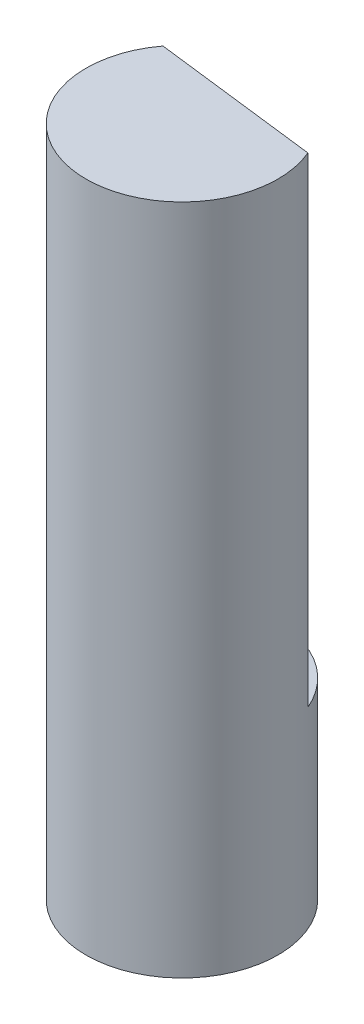
ISO-10303-21;
HEADER;
FILE_DESCRIPTION(('STEP AP214'),'2;1');
FILE_NAME('part.step','',(''),(''),'','','');
FILE_SCHEMA(('AUTOMOTIVE_DESIGN { 1 0 10303 214 1 1 1 1 }'));
ENDSEC;
DATA;
#1=APPLICATION_CONTEXT('core data for automotive mechanical design processes');
#2=APPLICATION_PROTOCOL_DEFINITION('international standard','automotive_design',2000,#1);
#3=PRODUCT_CONTEXT('',#1,'mechanical');
#4=PRODUCT('Part','Part','',(#3));
#5=PRODUCT_RELATED_PRODUCT_CATEGORY('part','',(#4));
#6=PRODUCT_DEFINITION_FORMATION('','',#4);
#7=PRODUCT_DEFINITION_CONTEXT('part definition',#1,'design');
#8=PRODUCT_DEFINITION('design','',#6,#7);
#9=PRODUCT_DEFINITION_SHAPE('','',#8);
#10=(LENGTH_UNIT() NAMED_UNIT(*) SI_UNIT(.MILLI.,.METRE.));
#11=(NAMED_UNIT(*) PLANE_ANGLE_UNIT() SI_UNIT($,.RADIAN.));
#12=(NAMED_UNIT(*) SI_UNIT($,.STERADIAN.) SOLID_ANGLE_UNIT());
#13=UNCERTAINTY_MEASURE_WITH_UNIT(LENGTH_MEASURE(1.E-05),#10,'distance_accuracy_value','');
#14=(GEOMETRIC_REPRESENTATION_CONTEXT(3) GLOBAL_UNCERTAINTY_ASSIGNED_CONTEXT((#13)) GLOBAL_UNIT_ASSIGNED_CONTEXT((#10,
#11,#12)) REPRESENTATION_CONTEXT('',''));
#15=CARTESIAN_POINT('',(0.,0.,0.));
#16=DIRECTION('',(0.,0.,1.));
#17=DIRECTION('',(1.,0.,0.));
#18=AXIS2_PLACEMENT_3D('',#15,#16,#17);
#19=CARTESIAN_POINT('',(0.,14.,0.));
#20=DIRECTION('',(0.,-1.,0.));
#21=DIRECTION('',(0.,0.,-1.));
#22=AXIS2_PLACEMENT_3D('',#19,#20,#21);
#23=CYLINDRICAL_SURFACE('',#22,2.);
#24=CARTESIAN_POINT('',(0.,14.,0.));
#25=DIRECTION('',(0.,1.,0.));
#26=DIRECTION('',(0.,0.,1.));
#27=AXIS2_PLACEMENT_3D('',#24,#25,#26);
#28=CIRCLE('',#27,2.);
#29=CARTESIAN_POINT('',(-1.59823271155388,14.,-1.20235277673365));
#30=VERTEX_POINT('',#29);
#31=CARTESIAN_POINT('',(1.84038440473904,14.,-0.782933740998126));
#32=VERTEX_POINT('',#31);
#33=EDGE_CURVE('E11',#30,#32,#28,.T.);
#34=ORIENTED_EDGE('',*,*,#33,.F.);
#35=DIRECTION('',(0.,1.,0.));
#36=VECTOR('',#35,1.);
#37=CARTESIAN_POINT('',(-1.59823271155388,4.,-1.20235277673365));
#38=LINE('',#37,#36);
#39=CARTESIAN_POINT('',(-1.59823271155388,4.,-1.20235277673365));
#40=VERTEX_POINT('',#39);
#41=EDGE_CURVE('E54',#40,#30,#38,.T.);
#42=ORIENTED_EDGE('',*,*,#41,.F.);
#43=CARTESIAN_POINT('',(0.,4.,0.));
#44=DIRECTION('',(0.,1.,0.));
#45=DIRECTION('',(0.,0.,1.));
#46=AXIS2_PLACEMENT_3D('',#43,#44,#45);
#47=CIRCLE('',#46,2.);
#48=CARTESIAN_POINT('',(1.84038440473904,4.,-0.782933740998126));
#49=VERTEX_POINT('',#48);
#50=EDGE_CURVE('E70',#49,#40,#47,.T.);
#51=ORIENTED_EDGE('',*,*,#50,.F.);
#52=DIRECTION('',(0.,1.,0.));
#53=VECTOR('',#52,1.);
#54=CARTESIAN_POINT('',(1.84038440473904,4.,-0.782933740998126));
#55=LINE('',#54,#53);
#56=EDGE_CURVE('E60',#49,#32,#55,.T.);
#57=ORIENTED_EDGE('',*,*,#56,.T.);
#58=EDGE_LOOP('',(#34,#42,#51,#57));
#59=FACE_BOUND('',#58,.T.);
#60=CARTESIAN_POINT('',(0.,0.,0.));
#61=DIRECTION('',(0.,1.,0.));
#62=DIRECTION('',(0.,0.,1.));
#63=AXIS2_PLACEMENT_3D('',#60,#61,#62);
#64=CIRCLE('',#63,2.);
#65=CARTESIAN_POINT('',(0.,0.,2.));
#66=VERTEX_POINT('',#65);
#67=EDGE_CURVE('E42',#66,#66,#64,.T.);
#68=ORIENTED_EDGE('',*,*,#67,.T.);
#69=EDGE_LOOP('',(#68));
#70=FACE_BOUND('',#69,.T.);
#71=ADVANCED_FACE('F39',(#59,#70),#23,.T.);
#72=CARTESIAN_POINT('',(0.,14.,0.));
#73=DIRECTION('',(0.,1.,0.));
#74=DIRECTION('',(0.,0.,1.));
#75=AXIS2_PLACEMENT_3D('',#72,#73,#74);
#76=PLANE('',#75);
#77=DIRECTION('',(0.992643258865888,0.,0.121075846592579));
#78=VECTOR('',#77,1.);
#79=CARTESIAN_POINT('',(0.121075846592579,14.,-0.992643258865888));
#80=LINE('',#79,#78);
#81=EDGE_CURVE('E65',#30,#32,#80,.T.);
#82=ORIENTED_EDGE('',*,*,#81,.F.);
#83=ORIENTED_EDGE('',*,*,#33,.T.);
#84=EDGE_LOOP('',(#82,#83));
#85=FACE_BOUND('',#84,.T.);
#86=ADVANCED_FACE('F77',(#85),#76,.T.);
#87=CARTESIAN_POINT('',(0.,0.,0.));
#88=DIRECTION('',(0.,1.,0.));
#89=DIRECTION('',(0.,0.,1.));
#90=AXIS2_PLACEMENT_3D('',#87,#88,#89);
#91=PLANE('',#90);
#92=ORIENTED_EDGE('',*,*,#67,.F.);
#93=EDGE_LOOP('',(#92));
#94=FACE_BOUND('',#93,.T.);
#95=ADVANCED_FACE('F79',(#94),#91,.F.);
#96=CARTESIAN_POINT('',(0.121075846592579,4.,-0.992643258865888));
#97=DIRECTION('',(-0.121075846592579,0.,0.992643258865888));
#98=DIRECTION('',(0.992643258865888,0.,0.121075846592579));
#99=AXIS2_PLACEMENT_3D('',#96,#97,#98);
#100=PLANE('',#99);
#101=ORIENTED_EDGE('',*,*,#81,.T.);
#102=ORIENTED_EDGE('',*,*,#56,.F.);
#103=DIRECTION('',(0.992643258865888,0.,0.121075846592579));
#104=VECTOR('',#103,1.);
#105=CARTESIAN_POINT('',(0.121075846592579,4.,-0.992643258865888));
#106=LINE('',#105,#104);
#107=EDGE_CURVE('E94',#40,#49,#106,.T.);
#108=ORIENTED_EDGE('',*,*,#107,.F.);
#109=ORIENTED_EDGE('',*,*,#41,.T.);
#110=EDGE_LOOP('',(#101,#102,#108,#109));
#111=FACE_BOUND('',#110,.T.);
#112=ADVANCED_FACE('F66',(#111),#100,.F.);
#113=CARTESIAN_POINT('',(0.,4.,0.));
#114=DIRECTION('',(0.,1.,0.));
#115=DIRECTION('',(0.,0.,1.));
#116=AXIS2_PLACEMENT_3D('',#113,#114,#115);
#117=PLANE('',#116);
#118=ORIENTED_EDGE('',*,*,#50,.T.);
#119=ORIENTED_EDGE('',*,*,#107,.T.);
#120=EDGE_LOOP('',(#118,#119));
#121=FACE_BOUND('',#120,.T.);
#122=ADVANCED_FACE('F89',(#121),#117,.T.);
#123=CLOSED_SHELL('',(#71,#86,#95,#112,#122));
#124=MANIFOLD_SOLID_BREP('B2',#123);
#125=ADVANCED_BREP_SHAPE_REPRESENTATION('',(#18,#124),#14);
#126=SHAPE_DEFINITION_REPRESENTATION(#9,#125);
ENDSEC;
END-ISO-10303-21;
